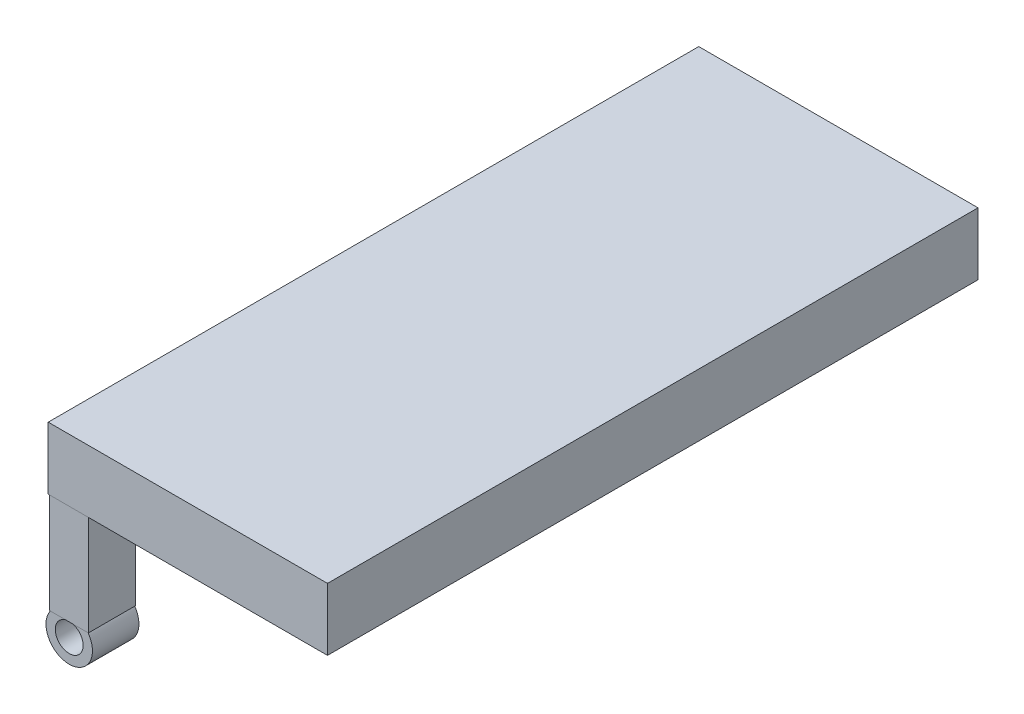
ISO-10303-21;
HEADER;
FILE_DESCRIPTION(('STEP AP214'),'2;1');
FILE_NAME('part.step','',(''),(''),'','','');
FILE_SCHEMA(('AUTOMOTIVE_DESIGN { 1 0 10303 214 1 1 1 1 }'));
ENDSEC;
DATA;
#1=APPLICATION_CONTEXT('core data for automotive mechanical design processes');
#2=APPLICATION_PROTOCOL_DEFINITION('international standard','automotive_design',2000,#1);
#3=PRODUCT_CONTEXT('',#1,'mechanical');
#4=PRODUCT('Part','Part','',(#3));
#5=PRODUCT_RELATED_PRODUCT_CATEGORY('part','',(#4));
#6=PRODUCT_DEFINITION_FORMATION('','',#4);
#7=PRODUCT_DEFINITION_CONTEXT('part definition',#1,'design');
#8=PRODUCT_DEFINITION('design','',#6,#7);
#9=PRODUCT_DEFINITION_SHAPE('','',#8);
#10=(LENGTH_UNIT() NAMED_UNIT(*) SI_UNIT(.MILLI.,.METRE.));
#11=(NAMED_UNIT(*) PLANE_ANGLE_UNIT() SI_UNIT($,.RADIAN.));
#12=(NAMED_UNIT(*) SI_UNIT($,.STERADIAN.) SOLID_ANGLE_UNIT());
#13=UNCERTAINTY_MEASURE_WITH_UNIT(LENGTH_MEASURE(1.E-05),#10,'distance_accuracy_value','');
#14=(GEOMETRIC_REPRESENTATION_CONTEXT(3) GLOBAL_UNCERTAINTY_ASSIGNED_CONTEXT((#13)) GLOBAL_UNIT_ASSIGNED_CONTEXT((#10,
#11,#12)) REPRESENTATION_CONTEXT('',''));
#15=CARTESIAN_POINT('',(0.,0.,0.));
#16=DIRECTION('',(0.,0.,1.));
#17=DIRECTION('',(1.,0.,0.));
#18=AXIS2_PLACEMENT_3D('',#15,#16,#17);
#19=CARTESIAN_POINT('',(0.,0.,10.));
#20=DIRECTION('',(0.,0.,-1.));
#21=DIRECTION('',(-1.,0.,0.));
#22=AXIS2_PLACEMENT_3D('',#19,#20,#21);
#23=CYLINDRICAL_SURFACE('',#22,5.);
#24=CARTESIAN_POINT('',(0.,0.,10.));
#25=DIRECTION('',(0.,0.,1.));
#26=DIRECTION('',(1.,0.,0.));
#27=AXIS2_PLACEMENT_3D('',#24,#25,#26);
#28=CIRCLE('',#27,5.);
#29=CARTESIAN_POINT('',(-4.00388151125443,2.99481766453902,10.));
#30=VERTEX_POINT('',#29);
#31=CARTESIAN_POINT('',(4.00388151125443,2.99481766453902,10.));
#32=VERTEX_POINT('',#31);
#33=EDGE_CURVE('E249',#30,#32,#28,.T.);
#34=ORIENTED_EDGE('',*,*,#33,.F.);
#35=DIRECTION('',(0.,0.,-1.));
#36=VECTOR('',#35,1.);
#37=CARTESIAN_POINT('',(-4.00388151125443,2.99481766453902,10.));
#38=LINE('',#37,#36);
#39=CARTESIAN_POINT('',(-4.00388151125443,2.99481766453902,0.));
#40=VERTEX_POINT('',#39);
#41=EDGE_CURVE('E236',#30,#40,#38,.T.);
#42=ORIENTED_EDGE('',*,*,#41,.T.);
#43=CARTESIAN_POINT('',(0.,0.,0.));
#44=DIRECTION('',(0.,0.,1.));
#45=DIRECTION('',(1.,0.,0.));
#46=AXIS2_PLACEMENT_3D('',#43,#44,#45);
#47=CIRCLE('',#46,5.);
#48=CARTESIAN_POINT('',(4.00388151125443,2.99481766453902,0.));
#49=VERTEX_POINT('',#48);
#50=EDGE_CURVE('E245',#40,#49,#47,.T.);
#51=ORIENTED_EDGE('',*,*,#50,.T.);
#52=DIRECTION('',(0.,0.,-1.));
#53=VECTOR('',#52,1.);
#54=CARTESIAN_POINT('',(4.00388151125443,2.99481766453902,10.));
#55=LINE('',#54,#53);
#56=EDGE_CURVE('E232',#49,#32,#55,.F.);
#57=ORIENTED_EDGE('',*,*,#56,.T.);
#58=EDGE_LOOP('',(#34,#42,#51,#57));
#59=FACE_BOUND('',#58,.T.);
#60=ADVANCED_FACE('F39',(#59),#23,.T.);
#61=CARTESIAN_POINT('',(0.,0.,10.));
#62=DIRECTION('',(0.,0.,1.));
#63=DIRECTION('',(1.,0.,0.));
#64=AXIS2_PLACEMENT_3D('',#61,#62,#63);
#65=PLANE('',#64);
#66=DIRECTION('',(1.,0.,0.));
#67=VECTOR('',#66,1.);
#68=CARTESIAN_POINT('',(0.,2.99481766453902,10.));
#69=LINE('',#68,#67);
#70=CARTESIAN_POINT('',(-0.176258776136337,2.99481766453902,10.));
#71=VERTEX_POINT('',#70);
#72=EDGE_CURVE('E231',#30,#71,#69,.T.);
#73=ORIENTED_EDGE('',*,*,#72,.F.);
#74=ORIENTED_EDGE('',*,*,#33,.T.);
#75=CARTESIAN_POINT('',(0.176258776136337,2.99481766453902,10.));
#76=VERTEX_POINT('',#75);
#77=EDGE_CURVE('E228',#76,#32,#69,.T.);
#78=ORIENTED_EDGE('',*,*,#77,.F.);
#79=CARTESIAN_POINT('',(0.,0.,10.));
#80=DIRECTION('',(0.,0.,1.));
#81=DIRECTION('',(1.,0.,0.));
#82=AXIS2_PLACEMENT_3D('',#79,#80,#81);
#83=CIRCLE('',#82,3.);
#84=EDGE_CURVE('E240',#71,#76,#83,.T.);
#85=ORIENTED_EDGE('',*,*,#84,.F.);
#86=EDGE_LOOP('',(#73,#74,#78,#85));
#87=FACE_BOUND('',#86,.T.);
#88=ADVANCED_FACE('F268',(#87),#65,.T.);
#89=CARTESIAN_POINT('',(0.,0.,0.));
#90=DIRECTION('',(0.,0.,1.));
#91=DIRECTION('',(1.,0.,0.));
#92=AXIS2_PLACEMENT_3D('',#89,#90,#91);
#93=PLANE('',#92);
#94=DIRECTION('',(0.,-1.,0.));
#95=VECTOR('',#94,1.);
#96=CARTESIAN_POINT('',(-4.1765976340816,5.95632081024178,0.));
#97=LINE('',#96,#95);
#98=CARTESIAN_POINT('',(-4.1765976340816,24.690118614989,0.));
#99=VERTEX_POINT('',#98);
#100=CARTESIAN_POINT('',(-4.1765976340816,2.99481766453902,0.));
#101=VERTEX_POINT('',#100);
#102=EDGE_CURVE('E203',#99,#101,#97,.T.);
#103=ORIENTED_EDGE('',*,*,#102,.F.);
#104=DIRECTION('',(1.,0.,0.));
#105=VECTOR('',#104,1.);
#106=CARTESIAN_POINT('',(0.,24.690118614989,0.));
#107=LINE('',#106,#105);
#108=CARTESIAN_POINT('',(4.21735625652553,24.690118614989,0.));
#109=VERTEX_POINT('',#108);
#110=EDGE_CURVE('E61',#99,#109,#107,.T.);
#111=ORIENTED_EDGE('',*,*,#110,.T.);
#112=DIRECTION('',(0.,1.,0.));
#113=VECTOR('',#112,1.);
#114=CARTESIAN_POINT('',(4.21735625652553,5.95632081024178,0.));
#115=LINE('',#114,#113);
#116=CARTESIAN_POINT('',(4.21735625652553,2.99481766453902,0.));
#117=VERTEX_POINT('',#116);
#118=EDGE_CURVE('E210',#117,#109,#115,.T.);
#119=ORIENTED_EDGE('',*,*,#118,.F.);
#120=DIRECTION('',(1.,0.,0.));
#121=VECTOR('',#120,1.);
#122=CARTESIAN_POINT('',(-4.1765976340816,2.99481766453902,0.));
#123=LINE('',#122,#121);
#124=EDGE_CURVE('E206',#49,#117,#123,.T.);
#125=ORIENTED_EDGE('',*,*,#124,.F.);
#126=ORIENTED_EDGE('',*,*,#50,.F.);
#127=EDGE_CURVE('E207',#101,#40,#123,.T.);
#128=ORIENTED_EDGE('',*,*,#127,.F.);
#129=EDGE_LOOP('',(#103,#111,#119,#125,#126,#128));
#130=FACE_BOUND('',#129,.T.);
#131=ADVANCED_FACE('F274',(#130),#93,.F.);
#132=CARTESIAN_POINT('',(0.,0.,2.));
#133=DIRECTION('',(0.,0.,1.));
#134=DIRECTION('',(1.,0.,0.));
#135=AXIS2_PLACEMENT_3D('',#132,#133,#134);
#136=CYLINDRICAL_SURFACE('',#135,3.);
#137=ORIENTED_EDGE('',*,*,#84,.T.);
#138=DIRECTION('',(0.,0.,1.));
#139=VECTOR('',#138,1.);
#140=CARTESIAN_POINT('',(0.176258776136337,2.99481766453902,2.));
#141=LINE('',#140,#139);
#142=CARTESIAN_POINT('',(0.176258776136337,2.99481766453902,2.));
#143=VERTEX_POINT('',#142);
#144=EDGE_CURVE('E224',#76,#143,#141,.F.);
#145=ORIENTED_EDGE('',*,*,#144,.T.);
#146=CARTESIAN_POINT('',(0.,0.,2.));
#147=DIRECTION('',(0.,0.,1.));
#148=DIRECTION('',(1.,0.,0.));
#149=AXIS2_PLACEMENT_3D('',#146,#147,#148);
#150=CIRCLE('',#149,3.);
#151=CARTESIAN_POINT('',(-0.176258776136337,2.99481766453902,2.));
#152=VERTEX_POINT('',#151);
#153=EDGE_CURVE('E241',#152,#143,#150,.T.);
#154=ORIENTED_EDGE('',*,*,#153,.F.);
#155=DIRECTION('',(0.,0.,1.));
#156=VECTOR('',#155,1.);
#157=CARTESIAN_POINT('',(-0.176258776136337,2.99481766453902,2.));
#158=LINE('',#157,#156);
#159=EDGE_CURVE('E217',#152,#71,#158,.T.);
#160=ORIENTED_EDGE('',*,*,#159,.T.);
#161=EDGE_LOOP('',(#137,#145,#154,#160));
#162=FACE_BOUND('',#161,.T.);
#163=ADVANCED_FACE('F262',(#162),#136,.F.);
#164=CARTESIAN_POINT('',(0.,0.,2.));
#165=DIRECTION('',(0.,0.,1.));
#166=DIRECTION('',(1.,0.,0.));
#167=AXIS2_PLACEMENT_3D('',#164,#165,#166);
#168=PLANE('',#167);
#169=DIRECTION('',(1.,0.,0.));
#170=VECTOR('',#169,1.);
#171=CARTESIAN_POINT('',(0.,2.99481766453902,2.));
#172=LINE('',#171,#170);
#173=EDGE_CURVE('E47',#143,#152,#172,.F.);
#174=ORIENTED_EDGE('',*,*,#173,.T.);
#175=ORIENTED_EDGE('',*,*,#153,.T.);
#176=EDGE_LOOP('',(#174,#175));
#177=FACE_BOUND('',#176,.T.);
#178=ADVANCED_FACE('F259',(#177),#168,.T.);
#179=CARTESIAN_POINT('',(-4.1765976340816,2.99481766453902,0.));
#180=DIRECTION('',(0.,-1.,0.));
#181=DIRECTION('',(0.,0.,-1.));
#182=AXIS2_PLACEMENT_3D('',#179,#180,#181);
#183=PLANE('',#182);
#184=ORIENTED_EDGE('',*,*,#41,.F.);
#185=ORIENTED_EDGE('',*,*,#72,.T.);
#186=ORIENTED_EDGE('',*,*,#159,.F.);
#187=ORIENTED_EDGE('',*,*,#173,.F.);
#188=ORIENTED_EDGE('',*,*,#144,.F.);
#189=ORIENTED_EDGE('',*,*,#77,.T.);
#190=ORIENTED_EDGE('',*,*,#56,.F.);
#191=ORIENTED_EDGE('',*,*,#124,.T.);
#192=DIRECTION('',(0.,0.,1.));
#193=VECTOR('',#192,1.);
#194=CARTESIAN_POINT('',(4.21735625652553,2.99481766453902,0.));
#195=LINE('',#194,#193);
#196=CARTESIAN_POINT('',(4.21735625652553,2.99481766453902,10.1));
#197=VERTEX_POINT('',#196);
#198=EDGE_CURVE('E214',#117,#197,#195,.T.);
#199=ORIENTED_EDGE('',*,*,#198,.T.);
#200=DIRECTION('',(1.,0.,0.));
#201=VECTOR('',#200,1.);
#202=CARTESIAN_POINT('',(-4.1765976340816,2.99481766453902,10.1));
#203=LINE('',#202,#201);
#204=CARTESIAN_POINT('',(-4.1765976340816,2.99481766453902,10.1));
#205=VERTEX_POINT('',#204);
#206=EDGE_CURVE('E196',#205,#197,#203,.T.);
#207=ORIENTED_EDGE('',*,*,#206,.F.);
#208=DIRECTION('',(0.,0.,1.));
#209=VECTOR('',#208,1.);
#210=CARTESIAN_POINT('',(-4.1765976340816,2.99481766453902,0.));
#211=LINE('',#210,#209);
#212=EDGE_CURVE('E213',#101,#205,#211,.T.);
#213=ORIENTED_EDGE('',*,*,#212,.F.);
#214=ORIENTED_EDGE('',*,*,#127,.T.);
#215=EDGE_LOOP('',(#184,#185,#186,#187,#188,#189,#190,#191,#199,#207,#213,#214));
#216=FACE_BOUND('',#215,.T.);
#217=ADVANCED_FACE('F265',(#216),#183,.T.);
#218=CARTESIAN_POINT('',(-4.1765976340816,5.95632081024178,0.));
#219=DIRECTION('',(-1.,0.,0.));
#220=DIRECTION('',(0.,0.,1.));
#221=AXIS2_PLACEMENT_3D('',#218,#219,#220);
#222=PLANE('',#221);
#223=DIRECTION('',(0.,0.,1.));
#224=VECTOR('',#223,1.);
#225=CARTESIAN_POINT('',(-4.1765976340816,24.690118614989,0.));
#226=LINE('',#225,#224);
#227=CARTESIAN_POINT('',(-4.1765976340816,24.690118614989,10.1));
#228=VERTEX_POINT('',#227);
#229=EDGE_CURVE('E54',#99,#228,#226,.T.);
#230=ORIENTED_EDGE('',*,*,#229,.F.);
#231=ORIENTED_EDGE('',*,*,#102,.T.);
#232=ORIENTED_EDGE('',*,*,#212,.T.);
#233=DIRECTION('',(0.,-1.,0.));
#234=VECTOR('',#233,1.);
#235=CARTESIAN_POINT('',(-4.1765976340816,5.95632081024178,10.1));
#236=LINE('',#235,#234);
#237=EDGE_CURVE('E193',#228,#205,#236,.T.);
#238=ORIENTED_EDGE('',*,*,#237,.F.);
#239=EDGE_LOOP('',(#230,#231,#232,#238));
#240=FACE_BOUND('',#239,.T.);
#241=ADVANCED_FACE('F286',(#240),#222,.T.);
#242=CARTESIAN_POINT('',(4.21735625652553,5.95632081024178,0.));
#243=DIRECTION('',(1.,0.,0.));
#244=DIRECTION('',(0.,0.,-1.));
#245=AXIS2_PLACEMENT_3D('',#242,#243,#244);
#246=PLANE('',#245);
#247=DIRECTION('',(0.,0.,-1.));
#248=VECTOR('',#247,1.);
#249=CARTESIAN_POINT('',(4.21735625652553,24.690118614989,0.));
#250=LINE('',#249,#248);
#251=CARTESIAN_POINT('',(4.21735625652553,24.690118614989,10.1));
#252=VERTEX_POINT('',#251);
#253=EDGE_CURVE('E180',#252,#109,#250,.T.);
#254=ORIENTED_EDGE('',*,*,#253,.F.);
#255=DIRECTION('',(0.,1.,0.));
#256=VECTOR('',#255,1.);
#257=CARTESIAN_POINT('',(4.21735625652553,5.95632081024178,10.1));
#258=LINE('',#257,#256);
#259=EDGE_CURVE('E200',#197,#252,#258,.T.);
#260=ORIENTED_EDGE('',*,*,#259,.F.);
#261=ORIENTED_EDGE('',*,*,#198,.F.);
#262=ORIENTED_EDGE('',*,*,#118,.T.);
#263=EDGE_LOOP('',(#254,#260,#261,#262));
#264=FACE_BOUND('',#263,.T.);
#265=ADVANCED_FACE('F283',(#264),#246,.T.);
#266=CARTESIAN_POINT('',(0.,0.,10.1));
#267=DIRECTION('',(0.,0.,1.));
#268=DIRECTION('',(1.,0.,0.));
#269=AXIS2_PLACEMENT_3D('',#266,#267,#268);
#270=PLANE('',#269);
#271=DIRECTION('',(1.,0.,0.));
#272=VECTOR('',#271,1.);
#273=CARTESIAN_POINT('',(0.,24.690118614989,10.1));
#274=LINE('',#273,#272);
#275=EDGE_CURVE('E11',#228,#252,#274,.T.);
#276=ORIENTED_EDGE('',*,*,#275,.F.);
#277=ORIENTED_EDGE('',*,*,#237,.T.);
#278=ORIENTED_EDGE('',*,*,#206,.T.);
#279=ORIENTED_EDGE('',*,*,#259,.T.);
#280=EDGE_LOOP('',(#276,#277,#278,#279));
#281=FACE_BOUND('',#280,.T.);
#282=ADVANCED_FACE('F285',(#281),#270,.T.);
#283=CARTESIAN_POINT('',(55.8234023659184,24.690118614989,-129.754924963225));
#284=DIRECTION('',(0.,-1.,0.));
#285=DIRECTION('',(0.,0.,-1.));
#286=AXIS2_PLACEMENT_3D('',#283,#284,#285);
#287=PLANE('',#286);
#288=DIRECTION('',(-1.,0.,0.));
#289=VECTOR('',#288,1.);
#290=CARTESIAN_POINT('',(55.8234023659184,24.690118614989,10.2450750367746));
#291=LINE('',#290,#289);
#292=CARTESIAN_POINT('',(55.8234023659184,24.690118614989,10.2450750367746));
#293=VERTEX_POINT('',#292);
#294=CARTESIAN_POINT('',(-4.2765976340816,24.690118614989,10.2450750367746));
#295=VERTEX_POINT('',#294);
#296=EDGE_CURVE('E141',#293,#295,#291,.T.);
#297=ORIENTED_EDGE('',*,*,#296,.T.);
#298=DIRECTION('',(0.,0.,1.));
#299=VECTOR('',#298,1.);
#300=CARTESIAN_POINT('',(-4.2765976340816,24.690118614989,-129.754924963225));
#301=LINE('',#300,#299);
#302=CARTESIAN_POINT('',(-4.2765976340816,24.690118614989,-129.754924963225));
#303=VERTEX_POINT('',#302);
#304=EDGE_CURVE('E145',#303,#295,#301,.T.);
#305=ORIENTED_EDGE('',*,*,#304,.F.);
#306=DIRECTION('',(-1.,0.,0.));
#307=VECTOR('',#306,1.);
#308=CARTESIAN_POINT('',(55.8234023659184,24.690118614989,-129.754924963225));
#309=LINE('',#308,#307);
#310=CARTESIAN_POINT('',(55.8234023659184,24.690118614989,-129.754924963225));
#311=VERTEX_POINT('',#310);
#312=EDGE_CURVE('E130',#311,#303,#309,.T.);
#313=ORIENTED_EDGE('',*,*,#312,.F.);
#314=DIRECTION('',(0.,0.,1.));
#315=VECTOR('',#314,1.);
#316=CARTESIAN_POINT('',(55.8234023659184,24.690118614989,-129.754924963225));
#317=LINE('',#316,#315);
#318=EDGE_CURVE('E167',#311,#293,#317,.T.);
#319=ORIENTED_EDGE('',*,*,#318,.T.);
#320=EDGE_LOOP('',(#297,#305,#313,#319));
#321=FACE_BOUND('',#320,.T.);
#322=ORIENTED_EDGE('',*,*,#110,.F.);
#323=ORIENTED_EDGE('',*,*,#229,.T.);
#324=ORIENTED_EDGE('',*,*,#275,.T.);
#325=ORIENTED_EDGE('',*,*,#253,.T.);
#326=EDGE_LOOP('',(#322,#323,#324,#325));
#327=FACE_BOUND('',#326,.T.);
#328=ADVANCED_FACE('F146',(#321,#327),#287,.T.);
#329=CARTESIAN_POINT('',(55.8234023659184,38.112417546806,-129.754924963225));
#330=DIRECTION('',(0.,0.,-1.));
#331=DIRECTION('',(-1.,0.,0.));
#332=AXIS2_PLACEMENT_3D('',#329,#330,#331);
#333=PLANE('',#332);
#334=ORIENTED_EDGE('',*,*,#312,.T.);
#335=DIRECTION('',(0.,-1.,0.));
#336=VECTOR('',#335,1.);
#337=CARTESIAN_POINT('',(-4.2765976340816,38.112417546806,-129.754924963225));
#338=LINE('',#337,#336);
#339=CARTESIAN_POINT('',(-4.2765976340816,38.112417546806,-129.754924963225));
#340=VERTEX_POINT('',#339);
#341=EDGE_CURVE('E134',#340,#303,#338,.T.);
#342=ORIENTED_EDGE('',*,*,#341,.F.);
#343=DIRECTION('',(-1.,0.,0.));
#344=VECTOR('',#343,1.);
#345=CARTESIAN_POINT('',(55.8234023659184,38.112417546806,-129.754924963225));
#346=LINE('',#345,#344);
#347=CARTESIAN_POINT('',(55.8234023659184,38.112417546806,-129.754924963225));
#348=VERTEX_POINT('',#347);
#349=EDGE_CURVE('E177',#348,#340,#346,.T.);
#350=ORIENTED_EDGE('',*,*,#349,.F.);
#351=DIRECTION('',(0.,-1.,0.));
#352=VECTOR('',#351,1.);
#353=CARTESIAN_POINT('',(55.8234023659184,38.112417546806,-129.754924963225));
#354=LINE('',#353,#352);
#355=EDGE_CURVE('E136',#348,#311,#354,.T.);
#356=ORIENTED_EDGE('',*,*,#355,.T.);
#357=EDGE_LOOP('',(#334,#342,#350,#356));
#358=FACE_BOUND('',#357,.T.);
#359=ADVANCED_FACE('F132',(#358),#333,.T.);
#360=CARTESIAN_POINT('',(55.8234023659184,38.112417546806,-129.754924963225));
#361=DIRECTION('',(0.,1.,0.));
#362=DIRECTION('',(0.,0.,1.));
#363=AXIS2_PLACEMENT_3D('',#360,#361,#362);
#364=PLANE('',#363);
#365=ORIENTED_EDGE('',*,*,#349,.T.);
#366=DIRECTION('',(0.,0.,-1.));
#367=VECTOR('',#366,1.);
#368=CARTESIAN_POINT('',(-4.2765976340816,38.112417546806,-129.754924963225));
#369=LINE('',#368,#367);
#370=CARTESIAN_POINT('',(-4.2765976340816,38.112417546806,10.2450750367746));
#371=VERTEX_POINT('',#370);
#372=EDGE_CURVE('E157',#371,#340,#369,.T.);
#373=ORIENTED_EDGE('',*,*,#372,.F.);
#374=DIRECTION('',(-1.,0.,0.));
#375=VECTOR('',#374,1.);
#376=CARTESIAN_POINT('',(55.8234023659184,38.112417546806,10.2450750367746));
#377=LINE('',#376,#375);
#378=CARTESIAN_POINT('',(55.8234023659184,38.112417546806,10.2450750367746));
#379=VERTEX_POINT('',#378);
#380=EDGE_CURVE('E181',#379,#371,#377,.T.);
#381=ORIENTED_EDGE('',*,*,#380,.F.);
#382=DIRECTION('',(0.,0.,-1.));
#383=VECTOR('',#382,1.);
#384=CARTESIAN_POINT('',(55.8234023659184,38.112417546806,-129.754924963225));
#385=LINE('',#384,#383);
#386=EDGE_CURVE('E142',#379,#348,#385,.T.);
#387=ORIENTED_EDGE('',*,*,#386,.T.);
#388=EDGE_LOOP('',(#365,#373,#381,#387));
#389=FACE_BOUND('',#388,.T.);
#390=ADVANCED_FACE('F360',(#389),#364,.T.);
#391=CARTESIAN_POINT('',(55.8234023659184,38.112417546806,10.2450750367746));
#392=DIRECTION('',(0.,0.,1.));
#393=DIRECTION('',(1.,0.,0.));
#394=AXIS2_PLACEMENT_3D('',#391,#392,#393);
#395=PLANE('',#394);
#396=ORIENTED_EDGE('',*,*,#380,.T.);
#397=DIRECTION('',(0.,1.,0.));
#398=VECTOR('',#397,1.);
#399=CARTESIAN_POINT('',(-4.2765976340816,38.112417546806,10.2450750367746));
#400=LINE('',#399,#398);
#401=EDGE_CURVE('E152',#295,#371,#400,.T.);
#402=ORIENTED_EDGE('',*,*,#401,.F.);
#403=ORIENTED_EDGE('',*,*,#296,.F.);
#404=DIRECTION('',(0.,1.,0.));
#405=VECTOR('',#404,1.);
#406=CARTESIAN_POINT('',(55.8234023659184,38.112417546806,10.2450750367746));
#407=LINE('',#406,#405);
#408=EDGE_CURVE('E170',#293,#379,#407,.T.);
#409=ORIENTED_EDGE('',*,*,#408,.T.);
#410=EDGE_LOOP('',(#396,#402,#403,#409));
#411=FACE_BOUND('',#410,.T.);
#412=ADVANCED_FACE('F369',(#411),#395,.T.);
#413=CARTESIAN_POINT('',(55.8234023659184,0.,0.));
#414=DIRECTION('',(-1.,0.,0.));
#415=DIRECTION('',(0.,0.,1.));
#416=AXIS2_PLACEMENT_3D('',#413,#414,#415);
#417=PLANE('',#416);
#418=ORIENTED_EDGE('',*,*,#355,.F.);
#419=ORIENTED_EDGE('',*,*,#386,.F.);
#420=ORIENTED_EDGE('',*,*,#408,.F.);
#421=ORIENTED_EDGE('',*,*,#318,.F.);
#422=EDGE_LOOP('',(#418,#419,#420,#421));
#423=FACE_BOUND('',#422,.T.);
#424=ADVANCED_FACE('F379',(#423),#417,.F.);
#425=CARTESIAN_POINT('',(-4.2765976340816,0.,0.));
#426=DIRECTION('',(-1.,0.,0.));
#427=DIRECTION('',(0.,0.,1.));
#428=AXIS2_PLACEMENT_3D('',#425,#426,#427);
#429=PLANE('',#428);
#430=ORIENTED_EDGE('',*,*,#341,.T.);
#431=ORIENTED_EDGE('',*,*,#304,.T.);
#432=ORIENTED_EDGE('',*,*,#401,.T.);
#433=ORIENTED_EDGE('',*,*,#372,.T.);
#434=EDGE_LOOP('',(#430,#431,#432,#433));
#435=FACE_BOUND('',#434,.T.);
#436=ADVANCED_FACE('F155',(#435),#429,.T.);
#437=CLOSED_SHELL('',(#60,#88,#131,#163,#178,#217,#241,#265,#282,#328,#359,#390,#412,#424,#436));
#438=MANIFOLD_SOLID_BREP('B2',#437);
#439=ADVANCED_BREP_SHAPE_REPRESENTATION('',(#18,#438),#14);
#440=SHAPE_DEFINITION_REPRESENTATION(#9,#439);
ENDSEC;
END-ISO-10303-21;
